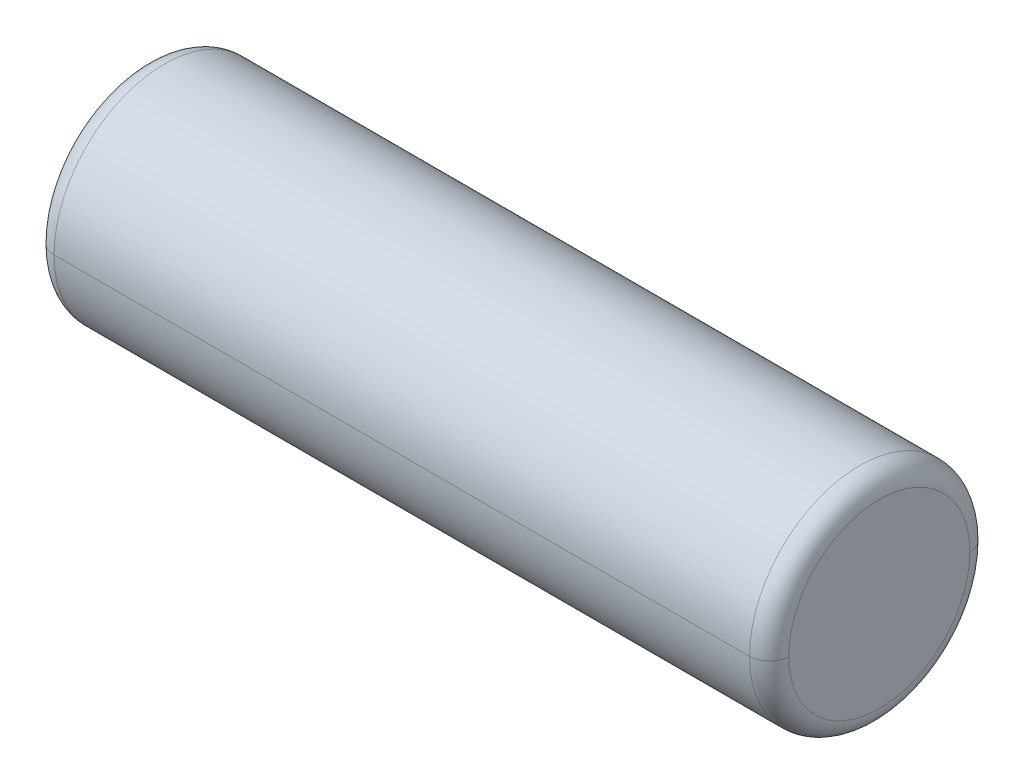
ISO-10303-21;
HEADER;
FILE_DESCRIPTION(('STEP AP214'),'2;1');
FILE_NAME('part.step','',(''),(''),'','','');
FILE_SCHEMA(('AUTOMOTIVE_DESIGN { 1 0 10303 214 1 1 1 1 }'));
ENDSEC;
DATA;
#1=APPLICATION_CONTEXT('core data for automotive mechanical design processes');
#2=APPLICATION_PROTOCOL_DEFINITION('international standard','automotive_design',2000,#1);
#3=PRODUCT_CONTEXT('',#1,'mechanical');
#4=PRODUCT('Part','Part','',(#3));
#5=PRODUCT_RELATED_PRODUCT_CATEGORY('part','',(#4));
#6=PRODUCT_DEFINITION_FORMATION('','',#4);
#7=PRODUCT_DEFINITION_CONTEXT('part definition',#1,'design');
#8=PRODUCT_DEFINITION('design','',#6,#7);
#9=PRODUCT_DEFINITION_SHAPE('','',#8);
#10=(LENGTH_UNIT() NAMED_UNIT(*) SI_UNIT(.MILLI.,.METRE.));
#11=(NAMED_UNIT(*) PLANE_ANGLE_UNIT() SI_UNIT($,.RADIAN.));
#12=(NAMED_UNIT(*) SI_UNIT($,.STERADIAN.) SOLID_ANGLE_UNIT());
#13=UNCERTAINTY_MEASURE_WITH_UNIT(LENGTH_MEASURE(1.E-05),#10,'distance_accuracy_value','');
#14=(GEOMETRIC_REPRESENTATION_CONTEXT(3) GLOBAL_UNCERTAINTY_ASSIGNED_CONTEXT((#13)) GLOBAL_UNIT_ASSIGNED_CONTEXT((#10,
#11,#12)) REPRESENTATION_CONTEXT('',''));
#15=CARTESIAN_POINT('',(0.,0.,0.));
#16=DIRECTION('',(0.,0.,1.));
#17=DIRECTION('',(1.,0.,0.));
#18=AXIS2_PLACEMENT_3D('',#15,#16,#17);
#19=CARTESIAN_POINT('',(2.36666666666671,0.,0.));
#20=DIRECTION('',(1.,0.,0.));
#21=DIRECTION('',(0.,1.,0.));
#22=AXIS2_PLACEMENT_3D('',#19,#20,#21);
#23=TOROIDAL_SURFACE('',#22,0.6166666667,0.1333333333);
#24=CARTESIAN_POINT('',(2.3666666666667,0.,0.));
#25=DIRECTION('',(1.,0.,0.));
#26=DIRECTION('',(0.,0.,-1.));
#27=AXIS2_PLACEMENT_3D('',#24,#25,#26);
#28=CIRCLE('',#27,0.75);
#29=CARTESIAN_POINT('',(2.36666666666671,0.,0.75));
#30=VERTEX_POINT('',#29);
#31=CARTESIAN_POINT('',(2.3666666666667,0.,-0.75));
#32=VERTEX_POINT('',#31);
#33=EDGE_CURVE('E11',#30,#32,#28,.T.);
#34=ORIENTED_EDGE('',*,*,#33,.T.);
#35=CARTESIAN_POINT('',(2.36666666666671,0.,-0.75));
#36=CARTESIAN_POINT('',(2.36884833043428,0.,-0.750000046278503));
#37=CARTESIAN_POINT('',(2.37102999026401,0.,-0.7499464556167));
#38=CARTESIAN_POINT('',(2.37538805622012,0.,-0.749732332704759));
#39=CARTESIAN_POINT('',(2.3775644623465,0.,-0.749571800454621));
#40=CARTESIAN_POINT('',(2.38190677506827,0.,-0.749144126658286));
#41=CARTESIAN_POINT('',(2.38407268166366,0.,-0.748876985112089));
#42=CARTESIAN_POINT('',(2.38838877818141,0.,-0.74823675087924));
#43=CARTESIAN_POINT('',(2.39053896810378,0.,-0.747863658192588));
#44=CARTESIAN_POINT('',(2.3948184510876,0.,-0.747012416582888));
#45=CARTESIAN_POINT('',(2.39694774414906,0.,-0.746534267659839));
#46=CARTESIAN_POINT('',(2.40118030380903,0.,-0.74547406652737));
#47=CARTESIAN_POINT('',(2.40328357040754,0.,-0.74489201431795));
#48=CARTESIAN_POINT('',(2.40745901017438,0.,-0.743625408546843));
#49=CARTESIAN_POINT('',(2.4095311833427,0.,-0.742940854985158));
#50=CARTESIAN_POINT('',(2.41363944420618,0.,-0.741470895734211));
#51=CARTESIAN_POINT('',(2.41567553190135,0.,-0.74068549004495));
#52=CARTESIAN_POINT('',(2.41970671670392,0.,-0.739015718629801));
#53=CARTESIAN_POINT('',(2.42170181381133,0.,-0.738131352903914));
#54=CARTESIAN_POINT('',(2.42564621107499,0.,-0.736265791935406));
#55=CARTESIAN_POINT('',(2.42759551123124,0.,-0.735284596692785));
#56=CARTESIAN_POINT('',(2.43144361855769,0.,-0.733227740474648));
#57=CARTESIAN_POINT('',(2.43334242572788,0.,-0.732152079499131));
#58=CARTESIAN_POINT('',(2.43708497268946,0.,-0.729908883177093));
#59=CARTESIAN_POINT('',(2.43892871248083,0.,-0.728741347830573));
#60=CARTESIAN_POINT('',(2.44255668295411,0.,-0.726317215461341));
#61=CARTESIAN_POINT('',(2.44434091363601,0.,-0.725060618438628));
#62=CARTESIAN_POINT('',(2.44784556752234,0.,-0.72246138996933));
#63=CARTESIAN_POINT('',(2.44956599072678,0.,-0.721118758522745));
#64=CARTESIAN_POINT('',(2.45293888500799,0.,-0.718350695722451));
#65=CARTESIAN_POINT('',(2.45459135608476,0.,-0.716925264368741));
#66=CARTESIAN_POINT('',(2.45782436516309,0.,-0.713995035743184));
#67=CARTESIAN_POINT('',(2.45940490316464,0.,-0.712490238471337));
#68=CARTESIAN_POINT('',(2.46249023843805,0.,-0.709404903197936));
#69=CARTESIAN_POINT('',(2.46399503570989,0.,-0.707824365196382));
#70=CARTESIAN_POINT('',(2.46692526433545,0.,-0.704591356118053));
#71=CARTESIAN_POINT('',(2.46835069568916,0.,-0.702938885041277));
#72=CARTESIAN_POINT('',(2.47111875848946,0.,-0.699565990760069));
#73=CARTESIAN_POINT('',(2.47246138993604,0.,-0.697845567555635));
#74=CARTESIAN_POINT('',(2.47506061840534,0.,-0.694340913669301));
#75=CARTESIAN_POINT('',(2.47631721542805,0.,-0.6925566829874));
#76=CARTESIAN_POINT('',(2.47874134779728,0.,-0.688928712514123));
#77=CARTESIAN_POINT('',(2.4799088831438,0.,-0.687084972722746));
#78=CARTESIAN_POINT('',(2.48215207946584,0.,-0.683342425761173));
#79=CARTESIAN_POINT('',(2.48322774044136,0.,-0.681443618590976));
#80=CARTESIAN_POINT('',(2.4852845966595,0.,-0.677595511264531));
#81=CARTESIAN_POINT('',(2.48626579190212,0.,-0.675646211108283));
#82=CARTESIAN_POINT('',(2.48813135287062,0.,-0.671701813844622));
#83=CARTESIAN_POINT('',(2.48901571859651,0.,-0.66970671673721));
#84=CARTESIAN_POINT('',(2.49068549001166,0.,-0.665675531934636));
#85=CARTESIAN_POINT('',(2.49147089570092,0.,-0.663639444239475));
#86=CARTESIAN_POINT('',(2.49294085495187,0.,-0.659531183375992));
#87=CARTESIAN_POINT('',(2.49362540851355,0.,-0.65745901020767));
#88=CARTESIAN_POINT('',(2.49489201428466,0.,-0.653283570440835));
#89=CARTESIAN_POINT('',(2.49547406649408,0.,-0.651180303842321));
#90=CARTESIAN_POINT('',(2.49653426762655,0.,-0.646947744182351));
#91=CARTESIAN_POINT('',(2.4970124165496,0.,-0.644818451120893));
#92=CARTESIAN_POINT('',(2.4978636581593,0.,-0.640538968137069));
#93=CARTESIAN_POINT('',(2.49823675084595,0.,-0.638388778214702));
#94=CARTESIAN_POINT('',(2.4988769850788,0.,-0.634072681696947));
#95=CARTESIAN_POINT('',(2.499144126625,0.,-0.631906775101559));
#96=CARTESIAN_POINT('',(2.49957180042133,0.,-0.62756446237979));
#97=CARTESIAN_POINT('',(2.49973233267147,0.,-0.625388056253408));
#98=CARTESIAN_POINT('',(2.49994645558341,0.,-0.6210299902973));
#99=CARTESIAN_POINT('',(2.50000004624521,0.,-0.618848330467573));
#100=CARTESIAN_POINT('',(2.49999999996671,0.,-0.6166666667));
#101=B_SPLINE_CURVE_WITH_KNOTS('',3,(#35,#36,#37,#38,#39,#40,#41,#42,#43,#44,#45,#46,#47,#48,
#49,#50,#51,#52,#53,#54,#55,#56,#57,#58,#59,#60,#61,#62,#63,#64,#65,#66,#67,#68,#69,#70,#71,#72,
#73,#74,#75,#76,#77,#78,#79,#80,#81,#82,#83,#84,#85,#86,#87,#88,#89,#90,#91,#92,#93,#94,#95,#96,
#97,#98,#99,#100),.UNSPECIFIED.,.F.,.F.,(4,2,2,2,2,2,2,2,2,2,2,2,2,2,2,2,2,2,2,2,2,2,2,2,2,2,2,
2,2,2,2,2,4),(0.,0.00654432760447383,0.0130886552089479,0.0196329828134216,0.0261773104178955,
0.0327216380223694,0.0392659656268432,0.045810293231317,0.0523546208357908,0.0588989484402649,
0.0654432760447385,0.0719876036492125,0.0785319312536862,0.0850762588581599,0.0916205864626341,
0.0981649140671077,0.104709241671582,0.111253569276056,0.117797896880529,0.124342224485003,
0.130886552089477,0.137430879693951,0.143975207298425,0.150519534902899,0.157063862507373,
0.163608190111846,0.17015251771632,0.176696845320794,0.183241172925268,0.189785500529742,
0.196329828134216,0.202874155738689,0.209418483343163),.UNSPECIFIED.);
#102=CARTESIAN_POINT('',(2.5,0.,-0.61666666666667));
#103=VERTEX_POINT('',#102);
#104=EDGE_CURVE('E26',#32,#103,#101,.T.);
#105=ORIENTED_EDGE('',*,*,#104,.T.);
#106=CARTESIAN_POINT('',(2.5,0.,0.));
#107=DIRECTION('',(1.,0.,0.));
#108=DIRECTION('',(0.,0.,-1.));
#109=AXIS2_PLACEMENT_3D('',#106,#107,#108);
#110=CIRCLE('',#109,0.6166666667);
#111=CARTESIAN_POINT('',(2.49999999996671,0.,0.6166666667));
#112=VERTEX_POINT('',#111);
#113=EDGE_CURVE('E147',#112,#103,#110,.T.);
#114=ORIENTED_EDGE('',*,*,#113,.F.);
#115=CARTESIAN_POINT('',(2.36666666666671,0.,0.75));
#116=CARTESIAN_POINT('',(2.36884833043428,0.,0.750000046278503));
#117=CARTESIAN_POINT('',(2.37102999026401,0.,0.749946455616701));
#118=CARTESIAN_POINT('',(2.37538805622012,0.,0.749732332704759));
#119=CARTESIAN_POINT('',(2.3775644623465,0.,0.749571800454621));
#120=CARTESIAN_POINT('',(2.38190677506827,0.,0.749144126658286));
#121=CARTESIAN_POINT('',(2.38407268166366,0.,0.748876985112089));
#122=CARTESIAN_POINT('',(2.38838877818141,0.,0.74823675087924));
#123=CARTESIAN_POINT('',(2.39053896810378,0.,0.747863658192588));
#124=CARTESIAN_POINT('',(2.3948184510876,0.,0.747012416582888));
#125=CARTESIAN_POINT('',(2.39694774414906,0.,0.746534267659839));
#126=CARTESIAN_POINT('',(2.40118030380903,0.,0.74547406652737));
#127=CARTESIAN_POINT('',(2.40328357040754,0.,0.74489201431795));
#128=CARTESIAN_POINT('',(2.40745901017438,0.,0.743625408546843));
#129=CARTESIAN_POINT('',(2.4095311833427,0.,0.742940854985158));
#130=CARTESIAN_POINT('',(2.41363944420618,0.,0.741470895734211));
#131=CARTESIAN_POINT('',(2.41567553190135,0.,0.74068549004495));
#132=CARTESIAN_POINT('',(2.41970671670392,0.,0.739015718629801));
#133=CARTESIAN_POINT('',(2.42170181381133,0.,0.738131352903913));
#134=CARTESIAN_POINT('',(2.42564621107499,0.,0.736265791935406));
#135=CARTESIAN_POINT('',(2.42759551123124,0.,0.735284596692785));
#136=CARTESIAN_POINT('',(2.43144361855769,0.,0.733227740474648));
#137=CARTESIAN_POINT('',(2.43334242572788,0.,0.732152079499131));
#138=CARTESIAN_POINT('',(2.43708497268946,0.,0.729908883177093));
#139=CARTESIAN_POINT('',(2.43892871248083,0.,0.728741347830573));
#140=CARTESIAN_POINT('',(2.44255668295411,0.,0.726317215461341));
#141=CARTESIAN_POINT('',(2.44434091363601,0.,0.725060618438628));
#142=CARTESIAN_POINT('',(2.44784556752235,0.,0.72246138996933));
#143=CARTESIAN_POINT('',(2.44956599072678,0.,0.721118758522745));
#144=CARTESIAN_POINT('',(2.45293888500799,0.,0.718350695722451));
#145=CARTESIAN_POINT('',(2.45459135608476,0.,0.716925264368741));
#146=CARTESIAN_POINT('',(2.45782436516309,0.,0.713995035743184));
#147=CARTESIAN_POINT('',(2.45940490316465,0.,0.712490238471337));
#148=CARTESIAN_POINT('',(2.46249023843805,0.,0.709404903197935));
#149=CARTESIAN_POINT('',(2.46399503570989,0.,0.707824365196382));
#150=CARTESIAN_POINT('',(2.46692526433545,0.,0.704591356118053));
#151=CARTESIAN_POINT('',(2.46835069568916,0.,0.702938885041277));
#152=CARTESIAN_POINT('',(2.47111875848946,0.,0.699565990760069));
#153=CARTESIAN_POINT('',(2.47246138993604,0.,0.697845567555635));
#154=CARTESIAN_POINT('',(2.47506061840534,0.,0.694340913669301));
#155=CARTESIAN_POINT('',(2.47631721542805,0.,0.6925566829874));
#156=CARTESIAN_POINT('',(2.47874134779728,0.,0.688928712514123));
#157=CARTESIAN_POINT('',(2.4799088831438,0.,0.687084972722746));
#158=CARTESIAN_POINT('',(2.48215207946584,0.,0.683342425761173));
#159=CARTESIAN_POINT('',(2.48322774044136,0.,0.681443618590976));
#160=CARTESIAN_POINT('',(2.4852845966595,0.,0.677595511264531));
#161=CARTESIAN_POINT('',(2.48626579190212,0.,0.675646211108283));
#162=CARTESIAN_POINT('',(2.48813135287062,0.,0.671701813844622));
#163=CARTESIAN_POINT('',(2.48901571859651,0.,0.669706716737209));
#164=CARTESIAN_POINT('',(2.49068549001166,0.,0.665675531934636));
#165=CARTESIAN_POINT('',(2.49147089570092,0.,0.663639444239475));
#166=CARTESIAN_POINT('',(2.49294085495187,0.,0.659531183375992));
#167=CARTESIAN_POINT('',(2.49362540851355,0.,0.65745901020767));
#168=CARTESIAN_POINT('',(2.49489201428466,0.,0.653283570440835));
#169=CARTESIAN_POINT('',(2.49547406649408,0.,0.651180303842321));
#170=CARTESIAN_POINT('',(2.49653426762655,0.,0.646947744182351));
#171=CARTESIAN_POINT('',(2.4970124165496,0.,0.644818451120893));
#172=CARTESIAN_POINT('',(2.4978636581593,0.,0.640538968137069));
#173=CARTESIAN_POINT('',(2.49823675084595,0.,0.638388778214701));
#174=CARTESIAN_POINT('',(2.4988769850788,0.,0.634072681696947));
#175=CARTESIAN_POINT('',(2.499144126625,0.,0.631906775101559));
#176=CARTESIAN_POINT('',(2.49957180042133,0.,0.627564462379789));
#177=CARTESIAN_POINT('',(2.49973233267147,0.,0.625388056253408));
#178=CARTESIAN_POINT('',(2.49994645558341,0.,0.6210299902973));
#179=CARTESIAN_POINT('',(2.50000004624521,0.,0.618848330467573));
#180=CARTESIAN_POINT('',(2.49999999996671,0.,0.6166666667));
#181=B_SPLINE_CURVE_WITH_KNOTS('',3,(#115,#116,#117,#118,#119,#120,#121,#122,#123,#124,#125,
#126,#127,#128,#129,#130,#131,#132,#133,#134,#135,#136,#137,#138,#139,#140,#141,#142,#143,#144,
#145,#146,#147,#148,#149,#150,#151,#152,#153,#154,#155,#156,#157,#158,#159,#160,#161,#162,#163,
#164,#165,#166,#167,#168,#169,#170,#171,#172,#173,#174,#175,#176,#177,#178,#179,#180),
.UNSPECIFIED.,.F.,.F.,(4,2,2,2,2,2,2,2,2,2,2,2,2,2,2,2,2,2,2,2,2,2,2,2,2,2,2,2,2,2,2,2,4),(0.,
0.00654432760447383,0.0130886552089479,0.0196329828134216,0.0261773104178955,0.0327216380223694,
0.0392659656268431,0.045810293231317,0.0523546208357908,0.0588989484402649,0.0654432760447385,
0.0719876036492125,0.0785319312536866,0.0850762588581603,0.0916205864626341,0.0981649140671081,
0.104709241671582,0.111253569276056,0.11779789688053,0.124342224485003,0.130886552089477,
0.137430879693951,0.143975207298425,0.150519534902899,0.157063862507373,0.163608190111846,
0.17015251771632,0.176696845320794,0.183241172925268,0.189785500529742,0.196329828134216,
0.20287415573869,0.209418483343163),.UNSPECIFIED.);
#182=EDGE_CURVE('E135',#30,#112,#181,.T.);
#183=ORIENTED_EDGE('',*,*,#182,.F.);
#184=EDGE_LOOP('',(#34,#105,#114,#183));
#185=FACE_BOUND('',#184,.T.);
#186=ADVANCED_FACE('F17',(#185),#23,.T.);
#187=CARTESIAN_POINT('',(2.36666666666671,0.,0.));
#188=DIRECTION('',(1.,0.,0.));
#189=DIRECTION('',(0.,-1.,0.));
#190=AXIS2_PLACEMENT_3D('',#187,#188,#189);
#191=TOROIDAL_SURFACE('',#190,0.6166666667,0.1333333333);
#192=CARTESIAN_POINT('',(2.5,0.,0.));
#193=DIRECTION('',(1.,0.,0.));
#194=DIRECTION('',(0.,0.,-1.));
#195=AXIS2_PLACEMENT_3D('',#192,#193,#194);
#196=CIRCLE('',#195,0.6166666667);
#197=EDGE_CURVE('E132',#103,#112,#196,.T.);
#198=ORIENTED_EDGE('',*,*,#197,.F.);
#199=ORIENTED_EDGE('',*,*,#104,.F.);
#200=CARTESIAN_POINT('',(2.3666666666667,0.,0.));
#201=DIRECTION('',(1.,0.,0.));
#202=DIRECTION('',(0.,0.,-1.));
#203=AXIS2_PLACEMENT_3D('',#200,#201,#202);
#204=CIRCLE('',#203,0.75);
#205=EDGE_CURVE('E97',#32,#30,#204,.T.);
#206=ORIENTED_EDGE('',*,*,#205,.T.);
#207=ORIENTED_EDGE('',*,*,#182,.T.);
#208=EDGE_LOOP('',(#198,#199,#206,#207));
#209=FACE_BOUND('',#208,.T.);
#210=ADVANCED_FACE('F105',(#209),#191,.T.);
#211=CARTESIAN_POINT('',(2.5,0.,0.));
#212=DIRECTION('',(-1.,0.,0.));
#213=DIRECTION('',(0.,-1.,0.));
#214=AXIS2_PLACEMENT_3D('',#211,#212,#213);
#215=CYLINDRICAL_SURFACE('',#214,0.75);
#216=ORIENTED_EDGE('',*,*,#205,.F.);
#217=DIRECTION('',(-1.,0.,0.));
#218=VECTOR('',#217,1.);
#219=CARTESIAN_POINT('',(2.3666666666667,0.,-0.75));
#220=LINE('',#219,#218);
#221=CARTESIAN_POINT('',(-2.3666666666667,0.,-0.75));
#222=VERTEX_POINT('',#221);
#223=EDGE_CURVE('E93',#32,#222,#220,.T.);
#224=ORIENTED_EDGE('',*,*,#223,.T.);
#225=CARTESIAN_POINT('',(-2.3666666666667,0.,0.));
#226=DIRECTION('',(1.,0.,0.));
#227=DIRECTION('',(0.,0.,-1.));
#228=AXIS2_PLACEMENT_3D('',#225,#226,#227);
#229=CIRCLE('',#228,0.75);
#230=CARTESIAN_POINT('',(-2.3666666666667,0.,0.75));
#231=VERTEX_POINT('',#230);
#232=EDGE_CURVE('E89',#222,#231,#229,.T.);
#233=ORIENTED_EDGE('',*,*,#232,.T.);
#234=DIRECTION('',(-1.,0.,0.));
#235=VECTOR('',#234,1.);
#236=CARTESIAN_POINT('',(2.3666666666667,0.,0.75));
#237=LINE('',#236,#235);
#238=EDGE_CURVE('E79',#30,#231,#237,.T.);
#239=ORIENTED_EDGE('',*,*,#238,.F.);
#240=EDGE_LOOP('',(#216,#224,#233,#239));
#241=FACE_BOUND('',#240,.T.);
#242=ADVANCED_FACE('F114',(#241),#215,.T.);
#243=CARTESIAN_POINT('',(2.5,0.,0.));
#244=DIRECTION('',(-1.,0.,0.));
#245=DIRECTION('',(0.,1.,0.));
#246=AXIS2_PLACEMENT_3D('',#243,#244,#245);
#247=CYLINDRICAL_SURFACE('',#246,0.75);
#248=CARTESIAN_POINT('',(-2.3666666666667,0.,0.));
#249=DIRECTION('',(1.,0.,0.));
#250=DIRECTION('',(0.,0.,-1.));
#251=AXIS2_PLACEMENT_3D('',#248,#249,#250);
#252=CIRCLE('',#251,0.75);
#253=EDGE_CURVE('E64',#231,#222,#252,.T.);
#254=ORIENTED_EDGE('',*,*,#253,.T.);
#255=ORIENTED_EDGE('',*,*,#223,.F.);
#256=ORIENTED_EDGE('',*,*,#33,.F.);
#257=ORIENTED_EDGE('',*,*,#238,.T.);
#258=EDGE_LOOP('',(#254,#255,#256,#257));
#259=FACE_BOUND('',#258,.T.);
#260=ADVANCED_FACE('F184',(#259),#247,.T.);
#261=CARTESIAN_POINT('',(-2.36666666666671,0.,0.));
#262=DIRECTION('',(1.,0.,0.));
#263=DIRECTION('',(0.,1.,0.));
#264=AXIS2_PLACEMENT_3D('',#261,#262,#263);
#265=TOROIDAL_SURFACE('',#264,0.6166666667,0.1333333333);
#266=CARTESIAN_POINT('',(-2.5,0.,0.));
#267=DIRECTION('',(1.,0.,0.));
#268=DIRECTION('',(0.,0.,-1.));
#269=AXIS2_PLACEMENT_3D('',#266,#267,#268);
#270=CIRCLE('',#269,0.6166666667);
#271=CARTESIAN_POINT('',(-2.49999999996671,0.,0.6166666667));
#272=VERTEX_POINT('',#271);
#273=CARTESIAN_POINT('',(-2.5,0.,-0.61666666666667));
#274=VERTEX_POINT('',#273);
#275=EDGE_CURVE('E61',#272,#274,#270,.T.);
#276=ORIENTED_EDGE('',*,*,#275,.T.);
#277=CARTESIAN_POINT('',(-2.49999999996671,0.,-0.6166666667));
#278=CARTESIAN_POINT('',(-2.50000004624521,0.,-0.618848330467573));
#279=CARTESIAN_POINT('',(-2.49994645558341,0.,-0.621029990297299));
#280=CARTESIAN_POINT('',(-2.49973233267147,0.,-0.625388056253407));
#281=CARTESIAN_POINT('',(-2.49957180042133,0.,-0.627564462379789));
#282=CARTESIAN_POINT('',(-2.499144126625,0.,-0.631906775101558));
#283=CARTESIAN_POINT('',(-2.4988769850788,0.,-0.634072681696946));
#284=CARTESIAN_POINT('',(-2.49823675084595,0.,-0.638388778214701));
#285=CARTESIAN_POINT('',(-2.4978636581593,0.,-0.640538968137068));
#286=CARTESIAN_POINT('',(-2.4970124165496,0.,-0.644818451120893));
#287=CARTESIAN_POINT('',(-2.49653426762655,0.,-0.64694774418235));
#288=CARTESIAN_POINT('',(-2.49547406649408,0.,-0.651180303842321));
#289=CARTESIAN_POINT('',(-2.49489201428466,0.,-0.653283570440834));
#290=CARTESIAN_POINT('',(-2.49362540851355,0.,-0.657459010207669));
#291=CARTESIAN_POINT('',(-2.49294085495187,0.,-0.659531183375991));
#292=CARTESIAN_POINT('',(-2.49147089570092,0.,-0.663639444239474));
#293=CARTESIAN_POINT('',(-2.49068549001166,0.,-0.665675531934635));
#294=CARTESIAN_POINT('',(-2.48901571859651,0.,-0.669706716737209));
#295=CARTESIAN_POINT('',(-2.48813135287062,0.,-0.671701813844622));
#296=CARTESIAN_POINT('',(-2.48626579190212,0.,-0.675646211108282));
#297=CARTESIAN_POINT('',(-2.4852845966595,0.,-0.67759551126453));
#298=CARTESIAN_POINT('',(-2.48322774044136,0.,-0.681443618590975));
#299=CARTESIAN_POINT('',(-2.48215207946584,0.,-0.683342425761172));
#300=CARTESIAN_POINT('',(-2.4799088831438,0.,-0.687084972722746));
#301=CARTESIAN_POINT('',(-2.47874134779728,0.,-0.688928712514122));
#302=CARTESIAN_POINT('',(-2.47631721542805,0.,-0.692556682987399));
#303=CARTESIAN_POINT('',(-2.47506061840534,0.,-0.6943409136693));
#304=CARTESIAN_POINT('',(-2.47246138993604,0.,-0.697845567555635));
#305=CARTESIAN_POINT('',(-2.47111875848946,0.,-0.699565990760068));
#306=CARTESIAN_POINT('',(-2.46835069568916,0.,-0.702938885041277));
#307=CARTESIAN_POINT('',(-2.46692526433545,0.,-0.704591356118052));
#308=CARTESIAN_POINT('',(-2.46399503570989,0.,-0.707824365196381));
#309=CARTESIAN_POINT('',(-2.46249023843805,0.,-0.709404903197935));
#310=CARTESIAN_POINT('',(-2.45940490316465,0.,-0.712490238471336));
#311=CARTESIAN_POINT('',(-2.45782436516309,0.,-0.713995035743184));
#312=CARTESIAN_POINT('',(-2.45459135608476,0.,-0.716925264368741));
#313=CARTESIAN_POINT('',(-2.45293888500799,0.,-0.71835069572245));
#314=CARTESIAN_POINT('',(-2.44956599072678,0.,-0.721118758522745));
#315=CARTESIAN_POINT('',(-2.44784556752235,0.,-0.72246138996933));
#316=CARTESIAN_POINT('',(-2.44434091363601,0.,-0.725060618438628));
#317=CARTESIAN_POINT('',(-2.44255668295411,0.,-0.72631721546134));
#318=CARTESIAN_POINT('',(-2.43892871248083,0.,-0.728741347830573));
#319=CARTESIAN_POINT('',(-2.43708497268946,0.,-0.729908883177093));
#320=CARTESIAN_POINT('',(-2.43334242572788,0.,-0.73215207949913));
#321=CARTESIAN_POINT('',(-2.43144361855769,0.,-0.733227740474648));
#322=CARTESIAN_POINT('',(-2.42759551123124,0.,-0.735284596692785));
#323=CARTESIAN_POINT('',(-2.42564621107499,0.,-0.736265791935405));
#324=CARTESIAN_POINT('',(-2.42170181381133,0.,-0.738131352903913));
#325=CARTESIAN_POINT('',(-2.41970671670392,0.,-0.739015718629801));
#326=CARTESIAN_POINT('',(-2.41567553190135,0.,-0.74068549004495));
#327=CARTESIAN_POINT('',(-2.41363944420619,0.,-0.741470895734211));
#328=CARTESIAN_POINT('',(-2.4095311833427,0.,-0.742940854985158));
#329=CARTESIAN_POINT('',(-2.40745901017438,0.,-0.743625408546843));
#330=CARTESIAN_POINT('',(-2.40328357040754,0.,-0.744892014317949));
#331=CARTESIAN_POINT('',(-2.40118030380903,0.,-0.74547406652737));
#332=CARTESIAN_POINT('',(-2.39694774414906,0.,-0.746534267659839));
#333=CARTESIAN_POINT('',(-2.3948184510876,0.,-0.747012416582887));
#334=CARTESIAN_POINT('',(-2.39053896810378,0.,-0.747863658192588));
#335=CARTESIAN_POINT('',(-2.38838877818141,0.,-0.74823675087924));
#336=CARTESIAN_POINT('',(-2.38407268166366,0.,-0.748876985112089));
#337=CARTESIAN_POINT('',(-2.38190677506827,0.,-0.749144126658286));
#338=CARTESIAN_POINT('',(-2.3775644623465,0.,-0.749571800454621));
#339=CARTESIAN_POINT('',(-2.37538805622012,0.,-0.749732332704759));
#340=CARTESIAN_POINT('',(-2.37102999026401,0.,-0.7499464556167));
#341=CARTESIAN_POINT('',(-2.36884833043428,0.,-0.750000046278503));
#342=CARTESIAN_POINT('',(-2.36666666666671,0.,-0.75));
#343=B_SPLINE_CURVE_WITH_KNOTS('',3,(#277,#278,#279,#280,#281,#282,#283,#284,#285,#286,#287,
#288,#289,#290,#291,#292,#293,#294,#295,#296,#297,#298,#299,#300,#301,#302,#303,#304,#305,#306,
#307,#308,#309,#310,#311,#312,#313,#314,#315,#316,#317,#318,#319,#320,#321,#322,#323,#324,#325,
#326,#327,#328,#329,#330,#331,#332,#333,#334,#335,#336,#337,#338,#339,#340,#341,#342),
.UNSPECIFIED.,.F.,.F.,(4,2,2,2,2,2,2,2,2,2,2,2,2,2,2,2,2,2,2,2,2,2,2,2,2,2,2,2,2,2,2,2,4),(0.,
0.00654432760447383,0.0130886552089477,0.0196329828134216,0.0261773104178954,0.0327216380223693,
0.0392659656268431,0.045810293231317,0.0523546208357908,0.0588989484402648,0.0654432760447385,
0.0719876036492123,0.0785319312536863,0.0850762588581601,0.0916205864626339,0.0981649140671079,
0.104709241671582,0.111253569276055,0.117797896880529,0.124342224485003,0.130886552089477,
0.137430879693951,0.143975207298425,0.150519534902899,0.157063862507373,0.163608190111846,
0.17015251771632,0.176696845320794,0.183241172925268,0.189785500529742,0.196329828134216,
0.20287415573869,0.209418483343164),.UNSPECIFIED.);
#344=EDGE_CURVE('E68',#274,#222,#343,.T.);
#345=ORIENTED_EDGE('',*,*,#344,.T.);
#346=ORIENTED_EDGE('',*,*,#253,.F.);
#347=CARTESIAN_POINT('',(-2.49999999996671,0.,0.6166666667));
#348=CARTESIAN_POINT('',(-2.50000004624521,0.,0.618848330467573));
#349=CARTESIAN_POINT('',(-2.49994645558341,0.,0.621029990297299));
#350=CARTESIAN_POINT('',(-2.49973233267147,0.,0.625388056253407));
#351=CARTESIAN_POINT('',(-2.49957180042133,0.,0.627564462379789));
#352=CARTESIAN_POINT('',(-2.499144126625,0.,0.631906775101559));
#353=CARTESIAN_POINT('',(-2.4988769850788,0.,0.634072681696946));
#354=CARTESIAN_POINT('',(-2.49823675084595,0.,0.638388778214701));
#355=CARTESIAN_POINT('',(-2.4978636581593,0.,0.640538968137068));
#356=CARTESIAN_POINT('',(-2.4970124165496,0.,0.644818451120893));
#357=CARTESIAN_POINT('',(-2.49653426762655,0.,0.64694774418235));
#358=CARTESIAN_POINT('',(-2.49547406649408,0.,0.651180303842321));
#359=CARTESIAN_POINT('',(-2.49489201428466,0.,0.653283570440834));
#360=CARTESIAN_POINT('',(-2.49362540851355,0.,0.65745901020767));
#361=CARTESIAN_POINT('',(-2.49294085495187,0.,0.659531183375991));
#362=CARTESIAN_POINT('',(-2.49147089570092,0.,0.663639444239474));
#363=CARTESIAN_POINT('',(-2.49068549001166,0.,0.665675531934635));
#364=CARTESIAN_POINT('',(-2.48901571859651,0.,0.669706716737209));
#365=CARTESIAN_POINT('',(-2.48813135287062,0.,0.671701813844622));
#366=CARTESIAN_POINT('',(-2.48626579190212,0.,0.675646211108282));
#367=CARTESIAN_POINT('',(-2.4852845966595,0.,0.67759551126453));
#368=CARTESIAN_POINT('',(-2.48322774044136,0.,0.681443618590975));
#369=CARTESIAN_POINT('',(-2.48215207946584,0.,0.683342425761172));
#370=CARTESIAN_POINT('',(-2.4799088831438,0.,0.687084972722746));
#371=CARTESIAN_POINT('',(-2.47874134779728,0.,0.688928712514122));
#372=CARTESIAN_POINT('',(-2.47631721542805,0.,0.6925566829874));
#373=CARTESIAN_POINT('',(-2.47506061840534,0.,0.6943409136693));
#374=CARTESIAN_POINT('',(-2.47246138993604,0.,0.697845567555635));
#375=CARTESIAN_POINT('',(-2.47111875848946,0.,0.699565990760068));
#376=CARTESIAN_POINT('',(-2.46835069568916,0.,0.702938885041277));
#377=CARTESIAN_POINT('',(-2.46692526433545,0.,0.704591356118052));
#378=CARTESIAN_POINT('',(-2.46399503570989,0.,0.707824365196381));
#379=CARTESIAN_POINT('',(-2.46249023843805,0.,0.709404903197935));
#380=CARTESIAN_POINT('',(-2.45940490316465,0.,0.712490238471337));
#381=CARTESIAN_POINT('',(-2.45782436516309,0.,0.713995035743184));
#382=CARTESIAN_POINT('',(-2.45459135608476,0.,0.716925264368741));
#383=CARTESIAN_POINT('',(-2.45293888500799,0.,0.71835069572245));
#384=CARTESIAN_POINT('',(-2.44956599072678,0.,0.721118758522745));
#385=CARTESIAN_POINT('',(-2.44784556752235,0.,0.72246138996933));
#386=CARTESIAN_POINT('',(-2.44434091363601,0.,0.725060618438628));
#387=CARTESIAN_POINT('',(-2.44255668295411,0.,0.72631721546134));
#388=CARTESIAN_POINT('',(-2.43892871248083,0.,0.728741347830573));
#389=CARTESIAN_POINT('',(-2.43708497268946,0.,0.729908883177093));
#390=CARTESIAN_POINT('',(-2.43334242572788,0.,0.73215207949913));
#391=CARTESIAN_POINT('',(-2.43144361855769,0.,0.733227740474648));
#392=CARTESIAN_POINT('',(-2.42759551123124,0.,0.735284596692785));
#393=CARTESIAN_POINT('',(-2.42564621107499,0.,0.736265791935405));
#394=CARTESIAN_POINT('',(-2.42170181381133,0.,0.738131352903913));
#395=CARTESIAN_POINT('',(-2.41970671670392,0.,0.739015718629801));
#396=CARTESIAN_POINT('',(-2.41567553190135,0.,0.74068549004495));
#397=CARTESIAN_POINT('',(-2.41363944420619,0.,0.741470895734211));
#398=CARTESIAN_POINT('',(-2.4095311833427,0.,0.742940854985158));
#399=CARTESIAN_POINT('',(-2.40745901017438,0.,0.743625408546843));
#400=CARTESIAN_POINT('',(-2.40328357040754,0.,0.744892014317949));
#401=CARTESIAN_POINT('',(-2.40118030380903,0.,0.74547406652737));
#402=CARTESIAN_POINT('',(-2.39694774414906,0.,0.746534267659839));
#403=CARTESIAN_POINT('',(-2.3948184510876,0.,0.747012416582887));
#404=CARTESIAN_POINT('',(-2.39053896810378,0.,0.747863658192588));
#405=CARTESIAN_POINT('',(-2.38838877818141,0.,0.74823675087924));
#406=CARTESIAN_POINT('',(-2.38407268166366,0.,0.748876985112089));
#407=CARTESIAN_POINT('',(-2.38190677506827,0.,0.749144126658286));
#408=CARTESIAN_POINT('',(-2.3775644623465,0.,0.749571800454621));
#409=CARTESIAN_POINT('',(-2.37538805622012,0.,0.749732332704759));
#410=CARTESIAN_POINT('',(-2.37102999026401,0.,0.7499464556167));
#411=CARTESIAN_POINT('',(-2.36884833043428,0.,0.750000046278503));
#412=CARTESIAN_POINT('',(-2.36666666666671,0.,0.75));
#413=B_SPLINE_CURVE_WITH_KNOTS('',3,(#347,#348,#349,#350,#351,#352,#353,#354,#355,#356,#357,
#358,#359,#360,#361,#362,#363,#364,#365,#366,#367,#368,#369,#370,#371,#372,#373,#374,#375,#376,
#377,#378,#379,#380,#381,#382,#383,#384,#385,#386,#387,#388,#389,#390,#391,#392,#393,#394,#395,
#396,#397,#398,#399,#400,#401,#402,#403,#404,#405,#406,#407,#408,#409,#410,#411,#412),
.UNSPECIFIED.,.F.,.F.,(4,2,2,2,2,2,2,2,2,2,2,2,2,2,2,2,2,2,2,2,2,2,2,2,2,2,2,2,2,2,2,2,4),(0.,
0.00654432760447383,0.0130886552089477,0.0196329828134216,0.0261773104178954,0.0327216380223693,
0.0392659656268431,0.045810293231317,0.0523546208357909,0.0588989484402648,0.0654432760447385,
0.0719876036492123,0.0785319312536863,0.08507625885816,0.0916205864626339,0.0981649140671078,
0.104709241671582,0.111253569276056,0.11779789688053,0.124342224485003,0.130886552089477,
0.137430879693951,0.143975207298425,0.150519534902899,0.157063862507373,0.163608190111846,
0.17015251771632,0.176696845320794,0.183241172925268,0.189785500529742,0.196329828134216,
0.20287415573869,0.209418483343163),.UNSPECIFIED.);
#414=EDGE_CURVE('E55',#272,#231,#413,.T.);
#415=ORIENTED_EDGE('',*,*,#414,.F.);
#416=EDGE_LOOP('',(#276,#345,#346,#415));
#417=FACE_BOUND('',#416,.T.);
#418=ADVANCED_FACE('F58',(#417),#265,.T.);
#419=CARTESIAN_POINT('',(-2.36666666666671,0.,0.));
#420=DIRECTION('',(1.,0.,0.));
#421=DIRECTION('',(0.,-1.,0.));
#422=AXIS2_PLACEMENT_3D('',#419,#420,#421);
#423=TOROIDAL_SURFACE('',#422,0.6166666667,0.1333333333);
#424=ORIENTED_EDGE('',*,*,#232,.F.);
#425=ORIENTED_EDGE('',*,*,#344,.F.);
#426=CARTESIAN_POINT('',(-2.5,0.,0.));
#427=DIRECTION('',(1.,0.,0.));
#428=DIRECTION('',(0.,0.,-1.));
#429=AXIS2_PLACEMENT_3D('',#426,#427,#428);
#430=CIRCLE('',#429,0.6166666667);
#431=EDGE_CURVE('E69',#274,#272,#430,.T.);
#432=ORIENTED_EDGE('',*,*,#431,.T.);
#433=ORIENTED_EDGE('',*,*,#414,.T.);
#434=EDGE_LOOP('',(#424,#425,#432,#433));
#435=FACE_BOUND('',#434,.T.);
#436=ADVANCED_FACE('F73',(#435),#423,.T.);
#437=CARTESIAN_POINT('',(-2.5,0.,0.));
#438=DIRECTION('',(1.,0.,0.));
#439=DIRECTION('',(0.,0.,-1.));
#440=AXIS2_PLACEMENT_3D('',#437,#438,#439);
#441=PLANE('',#440);
#442=ORIENTED_EDGE('',*,*,#431,.F.);
#443=ORIENTED_EDGE('',*,*,#275,.F.);
#444=EDGE_LOOP('',(#442,#443));
#445=FACE_BOUND('',#444,.T.);
#446=ADVANCED_FACE('F77',(#445),#441,.F.);
#447=CARTESIAN_POINT('',(2.5,0.61666666666667,0.));
#448=DIRECTION('',(-1.,0.,0.));
#449=DIRECTION('',(0.,0.,1.));
#450=AXIS2_PLACEMENT_3D('',#447,#448,#449);
#451=PLANE('',#450);
#452=ORIENTED_EDGE('',*,*,#197,.T.);
#453=ORIENTED_EDGE('',*,*,#113,.T.);
#454=EDGE_LOOP('',(#452,#453));
#455=FACE_BOUND('',#454,.T.);
#456=ADVANCED_FACE('F161',(#455),#451,.F.);
#457=CLOSED_SHELL('',(#186,#210,#242,#260,#418,#436,#446,#456));
#458=MANIFOLD_SOLID_BREP('B1',#457);
#459=ADVANCED_BREP_SHAPE_REPRESENTATION('',(#18,#458),#14);
#460=SHAPE_DEFINITION_REPRESENTATION(#9,#459);
ENDSEC;
END-ISO-10303-21;
